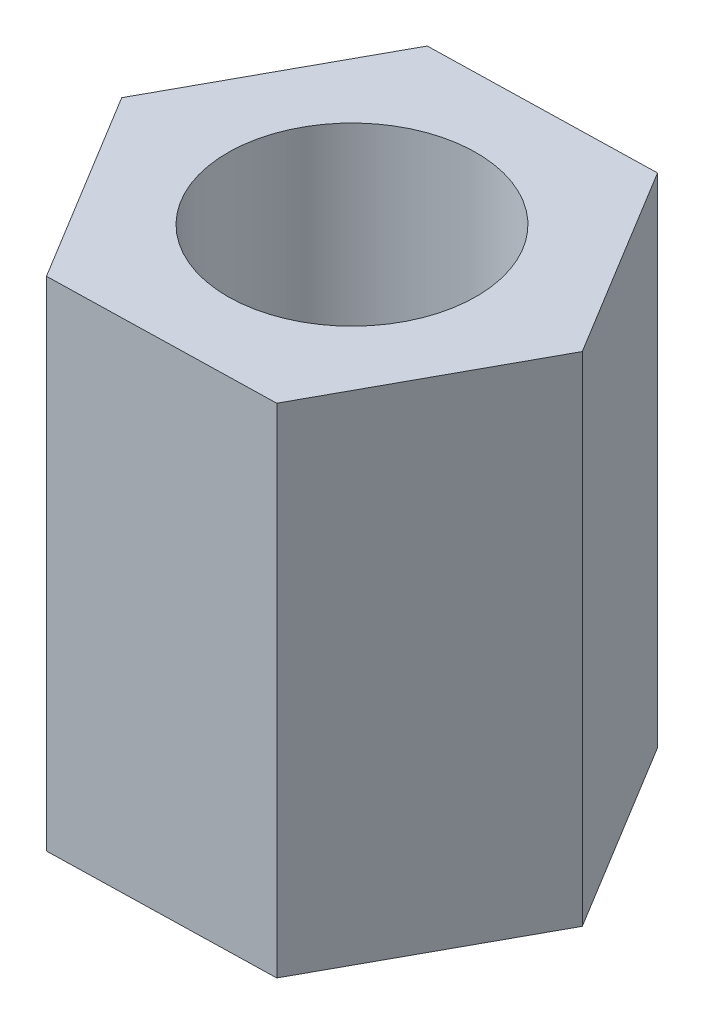
ISO-10303-21;
HEADER;
FILE_DESCRIPTION(('STEP AP214'),'2;1');
FILE_NAME('part.step','',(''),(''),'','','');
FILE_SCHEMA(('AUTOMOTIVE_DESIGN { 1 0 10303 214 1 1 1 1 }'));
ENDSEC;
DATA;
#1=APPLICATION_CONTEXT('core data for automotive mechanical design processes');
#2=APPLICATION_PROTOCOL_DEFINITION('international standard','automotive_design',2000,#1);
#3=PRODUCT_CONTEXT('',#1,'mechanical');
#4=PRODUCT('Part','Part','',(#3));
#5=PRODUCT_RELATED_PRODUCT_CATEGORY('part','',(#4));
#6=PRODUCT_DEFINITION_FORMATION('','',#4);
#7=PRODUCT_DEFINITION_CONTEXT('part definition',#1,'design');
#8=PRODUCT_DEFINITION('design','',#6,#7);
#9=PRODUCT_DEFINITION_SHAPE('','',#8);
#10=(LENGTH_UNIT() NAMED_UNIT(*) SI_UNIT(.MILLI.,.METRE.));
#11=(NAMED_UNIT(*) PLANE_ANGLE_UNIT() SI_UNIT($,.RADIAN.));
#12=(NAMED_UNIT(*) SI_UNIT($,.STERADIAN.) SOLID_ANGLE_UNIT());
#13=UNCERTAINTY_MEASURE_WITH_UNIT(LENGTH_MEASURE(1.E-05),#10,'distance_accuracy_value','');
#14=(GEOMETRIC_REPRESENTATION_CONTEXT(3) GLOBAL_UNCERTAINTY_ASSIGNED_CONTEXT((#13)) GLOBAL_UNIT_ASSIGNED_CONTEXT((#10,
#11,#12)) REPRESENTATION_CONTEXT('',''));
#15=CARTESIAN_POINT('',(0.,0.,0.));
#16=DIRECTION('',(0.,0.,1.));
#17=DIRECTION('',(1.,0.,0.));
#18=AXIS2_PLACEMENT_3D('',#15,#16,#17);
#19=CARTESIAN_POINT('',(0.,6.,0.));
#20=DIRECTION('',(0.,1.,0.));
#21=DIRECTION('',(0.,0.,1.));
#22=AXIS2_PLACEMENT_3D('',#19,#20,#21);
#23=PLANE('',#22);
#24=DIRECTION('',(0.999731122485951,0.,-0.0231879868246629));
#25=VECTOR('',#24,1.);
#26=CARTESIAN_POINT('',(-1.30191655777064,6.,2.38082897536467));
#27=LINE('',#26,#25);
#28=CARTESIAN_POINT('',(-1.30191655777064,6.,2.38082897536467));
#29=VERTEX_POINT('',#28);
#30=CARTESIAN_POINT('',(1.41090009584656,6.,2.3179073003193));
#31=VERTEX_POINT('',#30);
#32=EDGE_CURVE('E131',#29,#31,#27,.T.);
#33=ORIENTED_EDGE('',*,*,#32,.T.);
#34=DIRECTION('',(0.479784175590199,0.,-0.877386542439097));
#35=VECTOR('',#34,1.);
#36=CARTESIAN_POINT('',(1.41090009584656,6.,2.3179073003193));
#37=LINE('',#36,#35);
#38=CARTESIAN_POINT('',(2.7128166536172,6.,-0.062921675045368));
#39=VERTEX_POINT('',#38);
#40=EDGE_CURVE('E89',#31,#39,#37,.T.);
#41=ORIENTED_EDGE('',*,*,#40,.T.);
#42=DIRECTION('',(-0.519946946895752,0.,-0.854198555614434));
#43=VECTOR('',#42,1.);
#44=CARTESIAN_POINT('',(2.7128166536172,6.,-0.062921675045368));
#45=LINE('',#44,#43);
#46=CARTESIAN_POINT('',(1.30191655777064,6.,-2.38082897536467));
#47=VERTEX_POINT('',#46);
#48=EDGE_CURVE('E102',#39,#47,#45,.T.);
#49=ORIENTED_EDGE('',*,*,#48,.T.);
#50=DIRECTION('',(-0.999731122485951,0.,0.0231879868246627));
#51=VECTOR('',#50,1.);
#52=CARTESIAN_POINT('',(1.30191655777064,6.,-2.38082897536467));
#53=LINE('',#52,#51);
#54=CARTESIAN_POINT('',(-1.41090009584656,6.,-2.3179073003193));
#55=VERTEX_POINT('',#54);
#56=EDGE_CURVE('E96',#47,#55,#53,.T.);
#57=ORIENTED_EDGE('',*,*,#56,.T.);
#58=DIRECTION('',(-0.479784175590199,0.,0.877386542439097));
#59=VECTOR('',#58,1.);
#60=CARTESIAN_POINT('',(-1.41090009584656,6.,-2.3179073003193));
#61=LINE('',#60,#59);
#62=CARTESIAN_POINT('',(-2.7128166536172,6.,0.0629216750453662));
#63=VERTEX_POINT('',#62);
#64=EDGE_CURVE('E100',#55,#63,#61,.T.);
#65=ORIENTED_EDGE('',*,*,#64,.T.);
#66=DIRECTION('',(0.519946946895752,0.,0.854198555614434));
#67=VECTOR('',#66,1.);
#68=CARTESIAN_POINT('',(-2.7128166536172,6.,0.0629216750453662));
#69=LINE('',#68,#67);
#70=EDGE_CURVE('E52',#63,#29,#69,.T.);
#71=ORIENTED_EDGE('',*,*,#70,.T.);
#72=EDGE_LOOP('',(#33,#41,#49,#57,#65,#71));
#73=FACE_BOUND('',#72,.T.);
#74=CARTESIAN_POINT('',(0.,6.,0.));
#75=DIRECTION('',(0.,1.,0.));
#76=DIRECTION('',(0.,0.,1.));
#77=AXIS2_PLACEMENT_3D('',#74,#75,#76);
#78=CIRCLE('',#77,1.5);
#79=CARTESIAN_POINT('',(0.,6.,1.5));
#80=VERTEX_POINT('',#79);
#81=EDGE_CURVE('E124',#80,#80,#78,.T.);
#82=ORIENTED_EDGE('',*,*,#81,.F.);
#83=EDGE_LOOP('',(#82));
#84=FACE_BOUND('',#83,.T.);
#85=ADVANCED_FACE('F35',(#73,#84),#23,.T.);
#86=CARTESIAN_POINT('',(0.,0.,0.));
#87=DIRECTION('',(0.,1.,0.));
#88=DIRECTION('',(0.,0.,1.));
#89=AXIS2_PLACEMENT_3D('',#86,#87,#88);
#90=PLANE('',#89);
#91=DIRECTION('',(0.999731122485951,0.,-0.0231879868246629));
#92=VECTOR('',#91,1.);
#93=CARTESIAN_POINT('',(-1.30191655777064,0.,2.38082897536467));
#94=LINE('',#93,#92);
#95=CARTESIAN_POINT('',(-1.30191655777064,0.,2.38082897536467));
#96=VERTEX_POINT('',#95);
#97=CARTESIAN_POINT('',(1.41090009584656,0.,2.3179073003193));
#98=VERTEX_POINT('',#97);
#99=EDGE_CURVE('E120',#96,#98,#94,.T.);
#100=ORIENTED_EDGE('',*,*,#99,.F.);
#101=DIRECTION('',(0.519946946895752,0.,0.854198555614434));
#102=VECTOR('',#101,1.);
#103=CARTESIAN_POINT('',(-2.7128166536172,0.,0.0629216750453662));
#104=LINE('',#103,#102);
#105=CARTESIAN_POINT('',(-2.7128166536172,0.,0.0629216750453662));
#106=VERTEX_POINT('',#105);
#107=EDGE_CURVE('E81',#106,#96,#104,.T.);
#108=ORIENTED_EDGE('',*,*,#107,.F.);
#109=DIRECTION('',(-0.479784175590199,0.,0.877386542439097));
#110=VECTOR('',#109,1.);
#111=CARTESIAN_POINT('',(-1.41090009584656,0.,-2.3179073003193));
#112=LINE('',#111,#110);
#113=CARTESIAN_POINT('',(-1.41090009584656,0.,-2.3179073003193));
#114=VERTEX_POINT('',#113);
#115=EDGE_CURVE('E75',#114,#106,#112,.T.);
#116=ORIENTED_EDGE('',*,*,#115,.F.);
#117=DIRECTION('',(-0.999731122485951,0.,0.0231879868246627));
#118=VECTOR('',#117,1.);
#119=CARTESIAN_POINT('',(1.30191655777064,0.,-2.38082897536467));
#120=LINE('',#119,#118);
#121=CARTESIAN_POINT('',(1.30191655777064,0.,-2.38082897536467));
#122=VERTEX_POINT('',#121);
#123=EDGE_CURVE('E110',#122,#114,#120,.T.);
#124=ORIENTED_EDGE('',*,*,#123,.F.);
#125=DIRECTION('',(-0.519946946895752,0.,-0.854198555614434));
#126=VECTOR('',#125,1.);
#127=CARTESIAN_POINT('',(2.7128166536172,0.,-0.062921675045368));
#128=LINE('',#127,#126);
#129=CARTESIAN_POINT('',(2.7128166536172,0.,-0.062921675045368));
#130=VERTEX_POINT('',#129);
#131=EDGE_CURVE('E126',#130,#122,#128,.T.);
#132=ORIENTED_EDGE('',*,*,#131,.F.);
#133=DIRECTION('',(0.479784175590199,0.,-0.877386542439097));
#134=VECTOR('',#133,1.);
#135=CARTESIAN_POINT('',(1.41090009584656,0.,2.3179073003193));
#136=LINE('',#135,#134);
#137=EDGE_CURVE('E123',#98,#130,#136,.T.);
#138=ORIENTED_EDGE('',*,*,#137,.F.);
#139=EDGE_LOOP('',(#100,#108,#116,#124,#132,#138));
#140=FACE_BOUND('',#139,.T.);
#141=CARTESIAN_POINT('',(0.,0.,0.));
#142=DIRECTION('',(0.,1.,0.));
#143=DIRECTION('',(0.,0.,1.));
#144=AXIS2_PLACEMENT_3D('',#141,#142,#143);
#145=CIRCLE('',#144,1.5);
#146=CARTESIAN_POINT('',(0.,0.,1.5));
#147=VERTEX_POINT('',#146);
#148=EDGE_CURVE('E224',#147,#147,#145,.T.);
#149=ORIENTED_EDGE('',*,*,#148,.T.);
#150=EDGE_LOOP('',(#149));
#151=FACE_BOUND('',#150,.T.);
#152=ADVANCED_FACE('F140',(#140,#151),#90,.F.);
#153=CARTESIAN_POINT('',(-1.30191655777064,6.,2.38082897536467));
#154=DIRECTION('',(-0.0231879868246629,0.,-0.999731122485951));
#155=DIRECTION('',(-0.999731122485951,0.,0.0231879868246629));
#156=AXIS2_PLACEMENT_3D('',#153,#154,#155);
#157=PLANE('',#156);
#158=ORIENTED_EDGE('',*,*,#99,.T.);
#159=DIRECTION('',(0.,-1.,0.));
#160=VECTOR('',#159,1.);
#161=CARTESIAN_POINT('',(1.41090009584656,6.,2.3179073003193));
#162=LINE('',#161,#160);
#163=EDGE_CURVE('E11',#31,#98,#162,.T.);
#164=ORIENTED_EDGE('',*,*,#163,.F.);
#165=ORIENTED_EDGE('',*,*,#32,.F.);
#166=DIRECTION('',(0.,-1.,0.));
#167=VECTOR('',#166,1.);
#168=CARTESIAN_POINT('',(-1.30191655777064,6.,2.38082897536467));
#169=LINE('',#168,#167);
#170=EDGE_CURVE('E116',#29,#96,#169,.T.);
#171=ORIENTED_EDGE('',*,*,#170,.T.);
#172=EDGE_LOOP('',(#158,#164,#165,#171));
#173=FACE_BOUND('',#172,.T.);
#174=ADVANCED_FACE('F37',(#173),#157,.F.);
#175=CARTESIAN_POINT('',(1.41090009584656,6.,2.3179073003193));
#176=DIRECTION('',(-0.877386542439097,0.,-0.479784175590199));
#177=DIRECTION('',(-0.479784175590199,0.,0.877386542439097));
#178=AXIS2_PLACEMENT_3D('',#175,#176,#177);
#179=PLANE('',#178);
#180=ORIENTED_EDGE('',*,*,#137,.T.);
#181=DIRECTION('',(0.,-1.,0.));
#182=VECTOR('',#181,1.);
#183=CARTESIAN_POINT('',(2.7128166536172,6.,-0.062921675045368));
#184=LINE('',#183,#182);
#185=EDGE_CURVE('E44',#39,#130,#184,.T.);
#186=ORIENTED_EDGE('',*,*,#185,.F.);
#187=ORIENTED_EDGE('',*,*,#40,.F.);
#188=ORIENTED_EDGE('',*,*,#163,.T.);
#189=EDGE_LOOP('',(#180,#186,#187,#188));
#190=FACE_BOUND('',#189,.T.);
#191=ADVANCED_FACE('F165',(#190),#179,.F.);
#192=CARTESIAN_POINT('',(2.7128166536172,6.,-0.062921675045368));
#193=DIRECTION('',(-0.854198555614434,0.,0.519946946895752));
#194=DIRECTION('',(0.519946946895752,0.,0.854198555614434));
#195=AXIS2_PLACEMENT_3D('',#192,#193,#194);
#196=PLANE('',#195);
#197=ORIENTED_EDGE('',*,*,#131,.T.);
#198=DIRECTION('',(0.,-1.,0.));
#199=VECTOR('',#198,1.);
#200=CARTESIAN_POINT('',(1.30191655777064,6.,-2.38082897536467));
#201=LINE('',#200,#199);
#202=EDGE_CURVE('E111',#47,#122,#201,.T.);
#203=ORIENTED_EDGE('',*,*,#202,.F.);
#204=ORIENTED_EDGE('',*,*,#48,.F.);
#205=ORIENTED_EDGE('',*,*,#185,.T.);
#206=EDGE_LOOP('',(#197,#203,#204,#205));
#207=FACE_BOUND('',#206,.T.);
#208=ADVANCED_FACE('F137',(#207),#196,.F.);
#209=CARTESIAN_POINT('',(1.30191655777064,6.,-2.38082897536467));
#210=DIRECTION('',(0.0231879868246627,0.,0.999731122485951));
#211=DIRECTION('',(0.999731122485951,0.,-0.0231879868246627));
#212=AXIS2_PLACEMENT_3D('',#209,#210,#211);
#213=PLANE('',#212);
#214=ORIENTED_EDGE('',*,*,#123,.T.);
#215=DIRECTION('',(0.,-1.,0.));
#216=VECTOR('',#215,1.);
#217=CARTESIAN_POINT('',(-1.41090009584656,6.,-2.3179073003193));
#218=LINE('',#217,#216);
#219=EDGE_CURVE('E107',#55,#114,#218,.T.);
#220=ORIENTED_EDGE('',*,*,#219,.F.);
#221=ORIENTED_EDGE('',*,*,#56,.F.);
#222=ORIENTED_EDGE('',*,*,#202,.T.);
#223=EDGE_LOOP('',(#214,#220,#221,#222));
#224=FACE_BOUND('',#223,.T.);
#225=ADVANCED_FACE('F108',(#224),#213,.F.);
#226=CARTESIAN_POINT('',(-1.41090009584656,6.,-2.3179073003193));
#227=DIRECTION('',(0.877386542439097,0.,0.479784175590199));
#228=DIRECTION('',(0.479784175590199,0.,-0.877386542439097));
#229=AXIS2_PLACEMENT_3D('',#226,#227,#228);
#230=PLANE('',#229);
#231=ORIENTED_EDGE('',*,*,#115,.T.);
#232=DIRECTION('',(0.,-1.,0.));
#233=VECTOR('',#232,1.);
#234=CARTESIAN_POINT('',(-2.7128166536172,6.,0.0629216750453662));
#235=LINE('',#234,#233);
#236=EDGE_CURVE('E112',#63,#106,#235,.T.);
#237=ORIENTED_EDGE('',*,*,#236,.F.);
#238=ORIENTED_EDGE('',*,*,#64,.F.);
#239=ORIENTED_EDGE('',*,*,#219,.T.);
#240=EDGE_LOOP('',(#231,#237,#238,#239));
#241=FACE_BOUND('',#240,.T.);
#242=ADVANCED_FACE('F114',(#241),#230,.F.);
#243=CARTESIAN_POINT('',(-2.7128166536172,6.,0.0629216750453662));
#244=DIRECTION('',(0.854198555614434,0.,-0.519946946895752));
#245=DIRECTION('',(-0.519946946895752,0.,-0.854198555614435));
#246=AXIS2_PLACEMENT_3D('',#243,#244,#245);
#247=PLANE('',#246);
#248=ORIENTED_EDGE('',*,*,#107,.T.);
#249=ORIENTED_EDGE('',*,*,#170,.F.);
#250=ORIENTED_EDGE('',*,*,#70,.F.);
#251=ORIENTED_EDGE('',*,*,#236,.T.);
#252=EDGE_LOOP('',(#248,#249,#250,#251));
#253=FACE_BOUND('',#252,.T.);
#254=ADVANCED_FACE('F145',(#253),#247,.F.);
#255=CARTESIAN_POINT('',(0.,6.,0.));
#256=DIRECTION('',(0.,-1.,0.));
#257=DIRECTION('',(0.,0.,-1.));
#258=AXIS2_PLACEMENT_3D('',#255,#256,#257);
#259=CYLINDRICAL_SURFACE('',#258,1.5);
#260=ORIENTED_EDGE('',*,*,#81,.T.);
#261=EDGE_LOOP('',(#260));
#262=FACE_BOUND('',#261,.T.);
#263=ORIENTED_EDGE('',*,*,#148,.F.);
#264=EDGE_LOOP('',(#263));
#265=FACE_BOUND('',#264,.T.);
#266=ADVANCED_FACE('F147',(#262,#265),#259,.F.);
#267=CLOSED_SHELL('',(#85,#152,#174,#191,#208,#225,#242,#254,#266));
#268=MANIFOLD_SOLID_BREP('B2',#267);
#269=ADVANCED_BREP_SHAPE_REPRESENTATION('',(#18,#268),#14);
#270=SHAPE_DEFINITION_REPRESENTATION(#9,#269);
ENDSEC;
END-ISO-10303-21;
